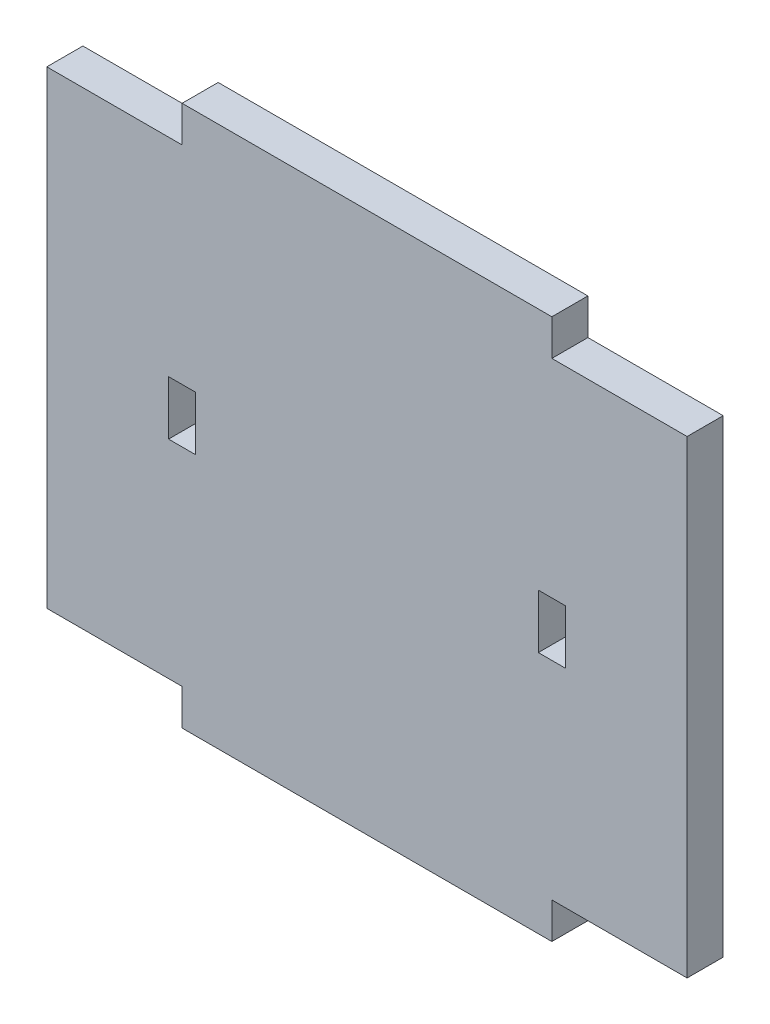
ISO-10303-21;
HEADER;
FILE_DESCRIPTION(('STEP AP214'),'2;1');
FILE_NAME('part.step','',(''),(''),'','','');
FILE_SCHEMA(('AUTOMOTIVE_DESIGN { 1 0 10303 214 1 1 1 1 }'));
ENDSEC;
DATA;
#1=APPLICATION_CONTEXT('core data for automotive mechanical design processes');
#2=APPLICATION_PROTOCOL_DEFINITION('international standard','automotive_design',2000,#1);
#3=PRODUCT_CONTEXT('',#1,'mechanical');
#4=PRODUCT('Part','Part','',(#3));
#5=PRODUCT_RELATED_PRODUCT_CATEGORY('part','',(#4));
#6=PRODUCT_DEFINITION_FORMATION('','',#4);
#7=PRODUCT_DEFINITION_CONTEXT('part definition',#1,'design');
#8=PRODUCT_DEFINITION('design','',#6,#7);
#9=PRODUCT_DEFINITION_SHAPE('','',#8);
#10=(LENGTH_UNIT() NAMED_UNIT(*) SI_UNIT(.MILLI.,.METRE.));
#11=(NAMED_UNIT(*) PLANE_ANGLE_UNIT() SI_UNIT($,.RADIAN.));
#12=(NAMED_UNIT(*) SI_UNIT($,.STERADIAN.) SOLID_ANGLE_UNIT());
#13=UNCERTAINTY_MEASURE_WITH_UNIT(LENGTH_MEASURE(1.E-05),#10,'distance_accuracy_value','');
#14=(GEOMETRIC_REPRESENTATION_CONTEXT(3) GLOBAL_UNCERTAINTY_ASSIGNED_CONTEXT((#13)) GLOBAL_UNIT_ASSIGNED_CONTEXT((#10,
#11,#12)) REPRESENTATION_CONTEXT('',''));
#15=CARTESIAN_POINT('',(0.,0.,0.));
#16=DIRECTION('',(0.,0.,1.));
#17=DIRECTION('',(1.,0.,0.));
#18=AXIS2_PLACEMENT_3D('',#15,#16,#17);
#19=CARTESIAN_POINT('',(-13.2631578947369,4.,4.));
#20=DIRECTION('',(1.,0.,0.));
#21=DIRECTION('',(0.,0.,-1.));
#22=AXIS2_PLACEMENT_3D('',#19,#20,#21);
#23=PLANE('',#22);
#24=DIRECTION('',(0.,-1.,0.));
#25=VECTOR('',#24,1.);
#26=CARTESIAN_POINT('',(-13.2631578947369,4.,0.));
#27=LINE('',#26,#25);
#28=CARTESIAN_POINT('',(-13.2631578947369,4.,0.));
#29=VERTEX_POINT('',#28);
#30=CARTESIAN_POINT('',(-13.2631578947369,0.,0.));
#31=VERTEX_POINT('',#30);
#32=EDGE_CURVE('E211',#29,#31,#27,.T.);
#33=ORIENTED_EDGE('',*,*,#32,.T.);
#34=DIRECTION('',(0.,0.,-1.));
#35=VECTOR('',#34,1.);
#36=CARTESIAN_POINT('',(-13.2631578947369,0.,4.));
#37=LINE('',#36,#35);
#38=CARTESIAN_POINT('',(-13.2631578947369,0.,4.));
#39=VERTEX_POINT('',#38);
#40=EDGE_CURVE('E300',#39,#31,#37,.T.);
#41=ORIENTED_EDGE('',*,*,#40,.F.);
#42=DIRECTION('',(0.,-1.,0.));
#43=VECTOR('',#42,1.);
#44=CARTESIAN_POINT('',(-13.2631578947369,4.,4.));
#45=LINE('',#44,#43);
#46=CARTESIAN_POINT('',(-13.2631578947369,4.,4.));
#47=VERTEX_POINT('',#46);
#48=EDGE_CURVE('E218',#47,#39,#45,.T.);
#49=ORIENTED_EDGE('',*,*,#48,.F.);
#50=DIRECTION('',(0.,0.,-1.));
#51=VECTOR('',#50,1.);
#52=CARTESIAN_POINT('',(-13.2631578947369,4.,4.));
#53=LINE('',#52,#51);
#54=EDGE_CURVE('E244',#47,#29,#53,.T.);
#55=ORIENTED_EDGE('',*,*,#54,.T.);
#56=EDGE_LOOP('',(#33,#41,#49,#55));
#57=FACE_BOUND('',#56,.T.);
#58=ADVANCED_FACE('F33',(#57),#23,.F.);
#59=CARTESIAN_POINT('',(-13.2631578947369,0.,4.));
#60=DIRECTION('',(0.,1.,0.));
#61=DIRECTION('',(0.,0.,1.));
#62=AXIS2_PLACEMENT_3D('',#59,#60,#61);
#63=PLANE('',#62);
#64=DIRECTION('',(1.,0.,0.));
#65=VECTOR('',#64,1.);
#66=CARTESIAN_POINT('',(-13.2631578947369,0.,0.));
#67=LINE('',#66,#65);
#68=CARTESIAN_POINT('',(27.7368421052632,0.,0.));
#69=VERTEX_POINT('',#68);
#70=EDGE_CURVE('E247',#31,#69,#67,.T.);
#71=ORIENTED_EDGE('',*,*,#70,.T.);
#72=DIRECTION('',(0.,0.,-1.));
#73=VECTOR('',#72,1.);
#74=CARTESIAN_POINT('',(27.7368421052632,0.,4.));
#75=LINE('',#74,#73);
#76=CARTESIAN_POINT('',(27.7368421052632,0.,4.));
#77=VERTEX_POINT('',#76);
#78=EDGE_CURVE('E297',#77,#69,#75,.T.);
#79=ORIENTED_EDGE('',*,*,#78,.F.);
#80=DIRECTION('',(1.,0.,0.));
#81=VECTOR('',#80,1.);
#82=CARTESIAN_POINT('',(-13.2631578947369,0.,4.));
#83=LINE('',#82,#81);
#84=EDGE_CURVE('E221',#39,#77,#83,.T.);
#85=ORIENTED_EDGE('',*,*,#84,.F.);
#86=ORIENTED_EDGE('',*,*,#40,.T.);
#87=EDGE_LOOP('',(#71,#79,#85,#86));
#88=FACE_BOUND('',#87,.T.);
#89=ADVANCED_FACE('F339',(#88),#63,.F.);
#90=CARTESIAN_POINT('',(27.7368421052632,0.,4.));
#91=DIRECTION('',(-1.,0.,0.));
#92=DIRECTION('',(0.,0.,1.));
#93=AXIS2_PLACEMENT_3D('',#90,#91,#92);
#94=PLANE('',#93);
#95=DIRECTION('',(0.,1.,0.));
#96=VECTOR('',#95,1.);
#97=CARTESIAN_POINT('',(27.7368421052632,0.,0.));
#98=LINE('',#97,#96);
#99=CARTESIAN_POINT('',(27.7368421052632,4.00000000000001,0.));
#100=VERTEX_POINT('',#99);
#101=EDGE_CURVE('E249',#69,#100,#98,.T.);
#102=ORIENTED_EDGE('',*,*,#101,.T.);
#103=DIRECTION('',(0.,0.,-1.));
#104=VECTOR('',#103,1.);
#105=CARTESIAN_POINT('',(27.7368421052632,4.00000000000001,4.));
#106=LINE('',#105,#104);
#107=CARTESIAN_POINT('',(27.7368421052632,4.00000000000001,4.));
#108=VERTEX_POINT('',#107);
#109=EDGE_CURVE('E294',#108,#100,#106,.T.);
#110=ORIENTED_EDGE('',*,*,#109,.F.);
#111=DIRECTION('',(0.,1.,0.));
#112=VECTOR('',#111,1.);
#113=CARTESIAN_POINT('',(27.7368421052632,0.,4.));
#114=LINE('',#113,#112);
#115=EDGE_CURVE('E224',#77,#108,#114,.T.);
#116=ORIENTED_EDGE('',*,*,#115,.F.);
#117=ORIENTED_EDGE('',*,*,#78,.T.);
#118=EDGE_LOOP('',(#102,#110,#116,#117));
#119=FACE_BOUND('',#118,.T.);
#120=ADVANCED_FACE('F344',(#119),#94,.F.);
#121=CARTESIAN_POINT('',(27.7368421052632,4.00000000000001,4.));
#122=DIRECTION('',(0.,1.,0.));
#123=DIRECTION('',(-1.,0.,0.));
#124=AXIS2_PLACEMENT_3D('',#121,#122,#123);
#125=PLANE('',#124);
#126=DIRECTION('',(1.,0.,0.));
#127=VECTOR('',#126,1.);
#128=CARTESIAN_POINT('',(27.7368421052632,4.00000000000001,0.));
#129=LINE('',#128,#127);
#130=CARTESIAN_POINT('',(42.7368421052632,4.00000000000001,0.));
#131=VERTEX_POINT('',#130);
#132=EDGE_CURVE('E251',#100,#131,#129,.T.);
#133=ORIENTED_EDGE('',*,*,#132,.T.);
#134=DIRECTION('',(0.,0.,-1.));
#135=VECTOR('',#134,1.);
#136=CARTESIAN_POINT('',(42.7368421052632,4.00000000000001,4.));
#137=LINE('',#136,#135);
#138=CARTESIAN_POINT('',(42.7368421052632,4.00000000000001,4.));
#139=VERTEX_POINT('',#138);
#140=EDGE_CURVE('E291',#139,#131,#137,.T.);
#141=ORIENTED_EDGE('',*,*,#140,.F.);
#142=DIRECTION('',(1.,0.,0.));
#143=VECTOR('',#142,1.);
#144=CARTESIAN_POINT('',(27.7368421052632,4.00000000000001,4.));
#145=LINE('',#144,#143);
#146=EDGE_CURVE('E226',#108,#139,#145,.T.);
#147=ORIENTED_EDGE('',*,*,#146,.F.);
#148=ORIENTED_EDGE('',*,*,#109,.T.);
#149=EDGE_LOOP('',(#133,#141,#147,#148));
#150=FACE_BOUND('',#149,.T.);
#151=ADVANCED_FACE('F397',(#150),#125,.F.);
#152=CARTESIAN_POINT('',(42.7368421052632,4.00000000000001,4.));
#153=DIRECTION('',(-1.,0.,0.));
#154=DIRECTION('',(0.,-1.,0.));
#155=AXIS2_PLACEMENT_3D('',#152,#153,#154);
#156=PLANE('',#155);
#157=DIRECTION('',(0.,1.,0.));
#158=VECTOR('',#157,1.);
#159=CARTESIAN_POINT('',(42.7368421052632,4.00000000000001,0.));
#160=LINE('',#159,#158);
#161=CARTESIAN_POINT('',(42.7368421052631,56.,0.));
#162=VERTEX_POINT('',#161);
#163=EDGE_CURVE('E253',#131,#162,#160,.T.);
#164=ORIENTED_EDGE('',*,*,#163,.T.);
#165=DIRECTION('',(0.,0.,-1.));
#166=VECTOR('',#165,1.);
#167=CARTESIAN_POINT('',(42.7368421052631,56.,4.));
#168=LINE('',#167,#166);
#169=CARTESIAN_POINT('',(42.7368421052631,56.,4.));
#170=VERTEX_POINT('',#169);
#171=EDGE_CURVE('E288',#170,#162,#168,.T.);
#172=ORIENTED_EDGE('',*,*,#171,.F.);
#173=DIRECTION('',(0.,1.,0.));
#174=VECTOR('',#173,1.);
#175=CARTESIAN_POINT('',(42.7368421052632,4.00000000000001,4.));
#176=LINE('',#175,#174);
#177=EDGE_CURVE('E228',#139,#170,#176,.T.);
#178=ORIENTED_EDGE('',*,*,#177,.F.);
#179=ORIENTED_EDGE('',*,*,#140,.T.);
#180=EDGE_LOOP('',(#164,#172,#178,#179));
#181=FACE_BOUND('',#180,.T.);
#182=ADVANCED_FACE('F394',(#181),#156,.F.);
#183=CARTESIAN_POINT('',(42.7368421052631,56.,4.));
#184=DIRECTION('',(0.,-1.,0.));
#185=DIRECTION('',(0.,0.,-1.));
#186=AXIS2_PLACEMENT_3D('',#183,#184,#185);
#187=PLANE('',#186);
#188=DIRECTION('',(-1.,0.,0.));
#189=VECTOR('',#188,1.);
#190=CARTESIAN_POINT('',(42.7368421052631,56.,0.));
#191=LINE('',#190,#189);
#192=CARTESIAN_POINT('',(27.7368421052631,56.,0.));
#193=VERTEX_POINT('',#192);
#194=EDGE_CURVE('E255',#162,#193,#191,.T.);
#195=ORIENTED_EDGE('',*,*,#194,.T.);
#196=DIRECTION('',(0.,0.,-1.));
#197=VECTOR('',#196,1.);
#198=CARTESIAN_POINT('',(27.7368421052631,56.,4.));
#199=LINE('',#198,#197);
#200=CARTESIAN_POINT('',(27.7368421052631,56.,4.));
#201=VERTEX_POINT('',#200);
#202=EDGE_CURVE('E285',#201,#193,#199,.T.);
#203=ORIENTED_EDGE('',*,*,#202,.F.);
#204=DIRECTION('',(-1.,0.,0.));
#205=VECTOR('',#204,1.);
#206=CARTESIAN_POINT('',(42.7368421052631,56.,4.));
#207=LINE('',#206,#205);
#208=EDGE_CURVE('E230',#170,#201,#207,.T.);
#209=ORIENTED_EDGE('',*,*,#208,.F.);
#210=ORIENTED_EDGE('',*,*,#171,.T.);
#211=EDGE_LOOP('',(#195,#203,#209,#210));
#212=FACE_BOUND('',#211,.T.);
#213=ADVANCED_FACE('F390',(#212),#187,.F.);
#214=CARTESIAN_POINT('',(27.7368421052631,56.,4.));
#215=DIRECTION('',(-1.,0.,0.));
#216=DIRECTION('',(0.,0.,1.));
#217=AXIS2_PLACEMENT_3D('',#214,#215,#216);
#218=PLANE('',#217);
#219=DIRECTION('',(0.,1.,0.));
#220=VECTOR('',#219,1.);
#221=CARTESIAN_POINT('',(27.7368421052631,56.,0.));
#222=LINE('',#221,#220);
#223=CARTESIAN_POINT('',(27.7368421052631,60.,0.));
#224=VERTEX_POINT('',#223);
#225=EDGE_CURVE('E257',#193,#224,#222,.T.);
#226=ORIENTED_EDGE('',*,*,#225,.T.);
#227=DIRECTION('',(0.,0.,-1.));
#228=VECTOR('',#227,1.);
#229=CARTESIAN_POINT('',(27.7368421052631,60.,4.));
#230=LINE('',#229,#228);
#231=CARTESIAN_POINT('',(27.7368421052631,60.,4.));
#232=VERTEX_POINT('',#231);
#233=EDGE_CURVE('E282',#232,#224,#230,.T.);
#234=ORIENTED_EDGE('',*,*,#233,.F.);
#235=DIRECTION('',(0.,1.,0.));
#236=VECTOR('',#235,1.);
#237=CARTESIAN_POINT('',(27.7368421052631,56.,4.));
#238=LINE('',#237,#236);
#239=EDGE_CURVE('E232',#201,#232,#238,.T.);
#240=ORIENTED_EDGE('',*,*,#239,.F.);
#241=ORIENTED_EDGE('',*,*,#202,.T.);
#242=EDGE_LOOP('',(#226,#234,#240,#241));
#243=FACE_BOUND('',#242,.T.);
#244=ADVANCED_FACE('F385',(#243),#218,.F.);
#245=CARTESIAN_POINT('',(27.7368421052631,60.,4.));
#246=DIRECTION('',(0.,-1.,0.));
#247=DIRECTION('',(0.,0.,-1.));
#248=AXIS2_PLACEMENT_3D('',#245,#246,#247);
#249=PLANE('',#248);
#250=DIRECTION('',(-1.,0.,0.));
#251=VECTOR('',#250,1.);
#252=CARTESIAN_POINT('',(27.7368421052631,60.,0.));
#253=LINE('',#252,#251);
#254=CARTESIAN_POINT('',(-13.2631578947369,60.,0.));
#255=VERTEX_POINT('',#254);
#256=EDGE_CURVE('E259',#224,#255,#253,.T.);
#257=ORIENTED_EDGE('',*,*,#256,.T.);
#258=DIRECTION('',(0.,0.,-1.));
#259=VECTOR('',#258,1.);
#260=CARTESIAN_POINT('',(-13.2631578947369,60.,4.));
#261=LINE('',#260,#259);
#262=CARTESIAN_POINT('',(-13.2631578947369,60.,4.));
#263=VERTEX_POINT('',#262);
#264=EDGE_CURVE('E279',#263,#255,#261,.T.);
#265=ORIENTED_EDGE('',*,*,#264,.F.);
#266=DIRECTION('',(-1.,0.,0.));
#267=VECTOR('',#266,1.);
#268=CARTESIAN_POINT('',(27.7368421052631,60.,4.));
#269=LINE('',#268,#267);
#270=EDGE_CURVE('E234',#232,#263,#269,.T.);
#271=ORIENTED_EDGE('',*,*,#270,.F.);
#272=ORIENTED_EDGE('',*,*,#233,.T.);
#273=EDGE_LOOP('',(#257,#265,#271,#272));
#274=FACE_BOUND('',#273,.T.);
#275=ADVANCED_FACE('F379',(#274),#249,.F.);
#276=CARTESIAN_POINT('',(-13.2631578947369,60.,4.));
#277=DIRECTION('',(1.,0.,0.));
#278=DIRECTION('',(0.,1.,0.));
#279=AXIS2_PLACEMENT_3D('',#276,#277,#278);
#280=PLANE('',#279);
#281=DIRECTION('',(0.,-1.,0.));
#282=VECTOR('',#281,1.);
#283=CARTESIAN_POINT('',(-13.2631578947369,60.,0.));
#284=LINE('',#283,#282);
#285=CARTESIAN_POINT('',(-13.2631578947369,56.,0.));
#286=VERTEX_POINT('',#285);
#287=EDGE_CURVE('E261',#255,#286,#284,.T.);
#288=ORIENTED_EDGE('',*,*,#287,.T.);
#289=DIRECTION('',(0.,0.,-1.));
#290=VECTOR('',#289,1.);
#291=CARTESIAN_POINT('',(-13.2631578947369,56.,4.));
#292=LINE('',#291,#290);
#293=CARTESIAN_POINT('',(-13.2631578947369,56.,4.));
#294=VERTEX_POINT('',#293);
#295=EDGE_CURVE('E276',#294,#286,#292,.T.);
#296=ORIENTED_EDGE('',*,*,#295,.F.);
#297=DIRECTION('',(0.,-1.,0.));
#298=VECTOR('',#297,1.);
#299=CARTESIAN_POINT('',(-13.2631578947369,60.,4.));
#300=LINE('',#299,#298);
#301=EDGE_CURVE('E236',#263,#294,#300,.T.);
#302=ORIENTED_EDGE('',*,*,#301,.F.);
#303=ORIENTED_EDGE('',*,*,#264,.T.);
#304=EDGE_LOOP('',(#288,#296,#302,#303));
#305=FACE_BOUND('',#304,.T.);
#306=ADVANCED_FACE('F375',(#305),#280,.F.);
#307=CARTESIAN_POINT('',(-13.2631578947369,56.,4.));
#308=DIRECTION('',(0.,-1.,0.));
#309=DIRECTION('',(0.,0.,-1.));
#310=AXIS2_PLACEMENT_3D('',#307,#308,#309);
#311=PLANE('',#310);
#312=DIRECTION('',(-1.,0.,0.));
#313=VECTOR('',#312,1.);
#314=CARTESIAN_POINT('',(-13.2631578947369,56.,0.));
#315=LINE('',#314,#313);
#316=CARTESIAN_POINT('',(-28.2631578947369,56.,0.));
#317=VERTEX_POINT('',#316);
#318=EDGE_CURVE('E263',#286,#317,#315,.T.);
#319=ORIENTED_EDGE('',*,*,#318,.T.);
#320=DIRECTION('',(0.,0.,-1.));
#321=VECTOR('',#320,1.);
#322=CARTESIAN_POINT('',(-28.2631578947369,56.,4.));
#323=LINE('',#322,#321);
#324=CARTESIAN_POINT('',(-28.2631578947369,56.,4.));
#325=VERTEX_POINT('',#324);
#326=EDGE_CURVE('E273',#325,#317,#323,.T.);
#327=ORIENTED_EDGE('',*,*,#326,.F.);
#328=DIRECTION('',(-1.,0.,0.));
#329=VECTOR('',#328,1.);
#330=CARTESIAN_POINT('',(-13.2631578947369,56.,4.));
#331=LINE('',#330,#329);
#332=EDGE_CURVE('E238',#294,#325,#331,.T.);
#333=ORIENTED_EDGE('',*,*,#332,.F.);
#334=ORIENTED_EDGE('',*,*,#295,.T.);
#335=EDGE_LOOP('',(#319,#327,#333,#334));
#336=FACE_BOUND('',#335,.T.);
#337=ADVANCED_FACE('F370',(#336),#311,.F.);
#338=CARTESIAN_POINT('',(-28.2631578947369,56.,4.));
#339=DIRECTION('',(1.,0.,0.));
#340=DIRECTION('',(0.,1.,0.));
#341=AXIS2_PLACEMENT_3D('',#338,#339,#340);
#342=PLANE('',#341);
#343=DIRECTION('',(0.,-1.,0.));
#344=VECTOR('',#343,1.);
#345=CARTESIAN_POINT('',(-28.2631578947369,56.,0.));
#346=LINE('',#345,#344);
#347=CARTESIAN_POINT('',(-28.2631578947368,4.,0.));
#348=VERTEX_POINT('',#347);
#349=EDGE_CURVE('E265',#317,#348,#346,.T.);
#350=ORIENTED_EDGE('',*,*,#349,.T.);
#351=DIRECTION('',(0.,0.,-1.));
#352=VECTOR('',#351,1.);
#353=CARTESIAN_POINT('',(-28.2631578947368,4.,4.));
#354=LINE('',#353,#352);
#355=CARTESIAN_POINT('',(-28.2631578947368,4.,4.));
#356=VERTEX_POINT('',#355);
#357=EDGE_CURVE('E270',#356,#348,#354,.T.);
#358=ORIENTED_EDGE('',*,*,#357,.F.);
#359=DIRECTION('',(0.,-1.,0.));
#360=VECTOR('',#359,1.);
#361=CARTESIAN_POINT('',(-28.2631578947369,56.,4.));
#362=LINE('',#361,#360);
#363=EDGE_CURVE('E240',#325,#356,#362,.T.);
#364=ORIENTED_EDGE('',*,*,#363,.F.);
#365=ORIENTED_EDGE('',*,*,#326,.T.);
#366=EDGE_LOOP('',(#350,#358,#364,#365));
#367=FACE_BOUND('',#366,.T.);
#368=ADVANCED_FACE('F364',(#367),#342,.F.);
#369=CARTESIAN_POINT('',(-28.2631578947368,4.,4.));
#370=DIRECTION('',(0.,1.,0.));
#371=DIRECTION('',(-1.,0.,0.));
#372=AXIS2_PLACEMENT_3D('',#369,#370,#371);
#373=PLANE('',#372);
#374=DIRECTION('',(1.,0.,0.));
#375=VECTOR('',#374,1.);
#376=CARTESIAN_POINT('',(-28.2631578947368,4.,0.));
#377=LINE('',#376,#375);
#378=EDGE_CURVE('E222',#348,#29,#377,.T.);
#379=ORIENTED_EDGE('',*,*,#378,.T.);
#380=ORIENTED_EDGE('',*,*,#54,.F.);
#381=DIRECTION('',(1.,0.,0.));
#382=VECTOR('',#381,1.);
#383=CARTESIAN_POINT('',(-28.2631578947368,4.,4.));
#384=LINE('',#383,#382);
#385=EDGE_CURVE('E242',#356,#47,#384,.T.);
#386=ORIENTED_EDGE('',*,*,#385,.F.);
#387=ORIENTED_EDGE('',*,*,#357,.T.);
#388=EDGE_LOOP('',(#379,#380,#386,#387));
#389=FACE_BOUND('',#388,.T.);
#390=ADVANCED_FACE('F362',(#389),#373,.F.);
#391=CARTESIAN_POINT('',(0.,0.,4.));
#392=DIRECTION('',(0.,0.,1.));
#393=DIRECTION('',(1.,0.,0.));
#394=AXIS2_PLACEMENT_3D('',#391,#392,#393);
#395=PLANE('',#394);
#396=DIRECTION('',(0.,1.,0.));
#397=VECTOR('',#396,1.);
#398=CARTESIAN_POINT('',(29.2368421052631,33.,4.));
#399=LINE('',#398,#397);
#400=CARTESIAN_POINT('',(29.2368421052631,27.,4.));
#401=VERTEX_POINT('',#400);
#402=CARTESIAN_POINT('',(29.2368421052631,33.,4.));
#403=VERTEX_POINT('',#402);
#404=EDGE_CURVE('E47',#401,#403,#399,.T.);
#405=ORIENTED_EDGE('',*,*,#404,.F.);
#406=DIRECTION('',(1.,0.,0.));
#407=VECTOR('',#406,1.);
#408=CARTESIAN_POINT('',(29.2368421052631,27.,4.));
#409=LINE('',#408,#407);
#410=CARTESIAN_POINT('',(26.2368421052631,27.,4.));
#411=VERTEX_POINT('',#410);
#412=EDGE_CURVE('E188',#411,#401,#409,.T.);
#413=ORIENTED_EDGE('',*,*,#412,.F.);
#414=DIRECTION('',(0.,-1.,0.));
#415=VECTOR('',#414,1.);
#416=CARTESIAN_POINT('',(26.2368421052631,33.,4.));
#417=LINE('',#416,#415);
#418=CARTESIAN_POINT('',(26.2368421052631,33.,4.));
#419=VERTEX_POINT('',#418);
#420=EDGE_CURVE('E172',#419,#411,#417,.T.);
#421=ORIENTED_EDGE('',*,*,#420,.F.);
#422=DIRECTION('',(-1.,0.,0.));
#423=VECTOR('',#422,1.);
#424=CARTESIAN_POINT('',(29.2368421052631,33.,4.));
#425=LINE('',#424,#423);
#426=EDGE_CURVE('E181',#403,#419,#425,.T.);
#427=ORIENTED_EDGE('',*,*,#426,.F.);
#428=EDGE_LOOP('',(#405,#413,#421,#427));
#429=FACE_BOUND('',#428,.T.);
#430=DIRECTION('',(0.,-1.,0.));
#431=VECTOR('',#430,1.);
#432=CARTESIAN_POINT('',(-14.7631578947369,33.,4.));
#433=LINE('',#432,#431);
#434=CARTESIAN_POINT('',(-14.7631578947369,33.,4.));
#435=VERTEX_POINT('',#434);
#436=CARTESIAN_POINT('',(-14.7631578947369,27.,4.));
#437=VERTEX_POINT('',#436);
#438=EDGE_CURVE('E195',#435,#437,#433,.T.);
#439=ORIENTED_EDGE('',*,*,#438,.F.);
#440=DIRECTION('',(-1.,0.,0.));
#441=VECTOR('',#440,1.);
#442=CARTESIAN_POINT('',(-14.7631578947369,33.,4.));
#443=LINE('',#442,#441);
#444=CARTESIAN_POINT('',(-11.7631578947369,33.,4.));
#445=VERTEX_POINT('',#444);
#446=EDGE_CURVE('E205',#445,#435,#443,.T.);
#447=ORIENTED_EDGE('',*,*,#446,.F.);
#448=DIRECTION('',(0.,1.,0.));
#449=VECTOR('',#448,1.);
#450=CARTESIAN_POINT('',(-11.7631578947369,33.,4.));
#451=LINE('',#450,#449);
#452=CARTESIAN_POINT('',(-11.7631578947369,27.,4.));
#453=VERTEX_POINT('',#452);
#454=EDGE_CURVE('E202',#453,#445,#451,.T.);
#455=ORIENTED_EDGE('',*,*,#454,.F.);
#456=DIRECTION('',(1.,0.,0.));
#457=VECTOR('',#456,1.);
#458=CARTESIAN_POINT('',(-14.7631578947369,27.,4.));
#459=LINE('',#458,#457);
#460=EDGE_CURVE('E199',#437,#453,#459,.T.);
#461=ORIENTED_EDGE('',*,*,#460,.F.);
#462=EDGE_LOOP('',(#439,#447,#455,#461));
#463=FACE_BOUND('',#462,.T.);
#464=ORIENTED_EDGE('',*,*,#48,.T.);
#465=ORIENTED_EDGE('',*,*,#84,.T.);
#466=ORIENTED_EDGE('',*,*,#115,.T.);
#467=ORIENTED_EDGE('',*,*,#146,.T.);
#468=ORIENTED_EDGE('',*,*,#177,.T.);
#469=ORIENTED_EDGE('',*,*,#208,.T.);
#470=ORIENTED_EDGE('',*,*,#239,.T.);
#471=ORIENTED_EDGE('',*,*,#270,.T.);
#472=ORIENTED_EDGE('',*,*,#301,.T.);
#473=ORIENTED_EDGE('',*,*,#332,.T.);
#474=ORIENTED_EDGE('',*,*,#363,.T.);
#475=ORIENTED_EDGE('',*,*,#385,.T.);
#476=EDGE_LOOP('',(#464,#465,#466,#467,#468,#469,#470,#471,#472,#473,#474,#475));
#477=FACE_BOUND('',#476,.T.);
#478=ADVANCED_FACE('F185',(#429,#463,#477),#395,.T.);
#479=CARTESIAN_POINT('',(0.,0.,0.));
#480=DIRECTION('',(0.,0.,1.));
#481=DIRECTION('',(1.,0.,0.));
#482=AXIS2_PLACEMENT_3D('',#479,#480,#481);
#483=PLANE('',#482);
#484=DIRECTION('',(1.,0.,0.));
#485=VECTOR('',#484,1.);
#486=CARTESIAN_POINT('',(0.,27.,0.));
#487=LINE('',#486,#485);
#488=CARTESIAN_POINT('',(26.2368421052631,27.,0.));
#489=VERTEX_POINT('',#488);
#490=CARTESIAN_POINT('',(29.2368421052631,27.,0.));
#491=VERTEX_POINT('',#490);
#492=EDGE_CURVE('E40',#489,#491,#487,.T.);
#493=ORIENTED_EDGE('',*,*,#492,.T.);
#494=DIRECTION('',(0.,1.,0.));
#495=VECTOR('',#494,1.);
#496=CARTESIAN_POINT('',(29.2368421052631,0.,0.));
#497=LINE('',#496,#495);
#498=CARTESIAN_POINT('',(29.2368421052631,33.,0.));
#499=VERTEX_POINT('',#498);
#500=EDGE_CURVE('E11',#491,#499,#497,.T.);
#501=ORIENTED_EDGE('',*,*,#500,.T.);
#502=DIRECTION('',(-1.,0.,0.));
#503=VECTOR('',#502,1.);
#504=CARTESIAN_POINT('',(0.,33.,0.));
#505=LINE('',#504,#503);
#506=CARTESIAN_POINT('',(26.2368421052631,33.,0.));
#507=VERTEX_POINT('',#506);
#508=EDGE_CURVE('E315',#499,#507,#505,.T.);
#509=ORIENTED_EDGE('',*,*,#508,.T.);
#510=DIRECTION('',(0.,-1.,0.));
#511=VECTOR('',#510,1.);
#512=CARTESIAN_POINT('',(26.2368421052631,0.,0.));
#513=LINE('',#512,#511);
#514=EDGE_CURVE('E175',#507,#489,#513,.T.);
#515=ORIENTED_EDGE('',*,*,#514,.T.);
#516=EDGE_LOOP('',(#493,#501,#509,#515));
#517=FACE_BOUND('',#516,.T.);
#518=DIRECTION('',(-1.,0.,0.));
#519=VECTOR('',#518,1.);
#520=CARTESIAN_POINT('',(0.,33.,0.));
#521=LINE('',#520,#519);
#522=CARTESIAN_POINT('',(-11.7631578947369,33.,0.));
#523=VERTEX_POINT('',#522);
#524=CARTESIAN_POINT('',(-14.7631578947369,33.,0.));
#525=VERTEX_POINT('',#524);
#526=EDGE_CURVE('E309',#523,#525,#521,.T.);
#527=ORIENTED_EDGE('',*,*,#526,.T.);
#528=DIRECTION('',(0.,-1.,0.));
#529=VECTOR('',#528,1.);
#530=CARTESIAN_POINT('',(-14.7631578947369,0.,0.));
#531=LINE('',#530,#529);
#532=CARTESIAN_POINT('',(-14.7631578947369,27.,0.));
#533=VERTEX_POINT('',#532);
#534=EDGE_CURVE('E312',#525,#533,#531,.T.);
#535=ORIENTED_EDGE('',*,*,#534,.T.);
#536=DIRECTION('',(1.,0.,0.));
#537=VECTOR('',#536,1.);
#538=CARTESIAN_POINT('',(0.,27.,0.));
#539=LINE('',#538,#537);
#540=CARTESIAN_POINT('',(-11.7631578947369,27.,0.));
#541=VERTEX_POINT('',#540);
#542=EDGE_CURVE('E303',#533,#541,#539,.T.);
#543=ORIENTED_EDGE('',*,*,#542,.T.);
#544=DIRECTION('',(0.,1.,0.));
#545=VECTOR('',#544,1.);
#546=CARTESIAN_POINT('',(-11.7631578947369,0.,0.));
#547=LINE('',#546,#545);
#548=EDGE_CURVE('E306',#541,#523,#547,.T.);
#549=ORIENTED_EDGE('',*,*,#548,.T.);
#550=EDGE_LOOP('',(#527,#535,#543,#549));
#551=FACE_BOUND('',#550,.T.);
#552=ORIENTED_EDGE('',*,*,#32,.F.);
#553=ORIENTED_EDGE('',*,*,#378,.F.);
#554=ORIENTED_EDGE('',*,*,#349,.F.);
#555=ORIENTED_EDGE('',*,*,#318,.F.);
#556=ORIENTED_EDGE('',*,*,#287,.F.);
#557=ORIENTED_EDGE('',*,*,#256,.F.);
#558=ORIENTED_EDGE('',*,*,#225,.F.);
#559=ORIENTED_EDGE('',*,*,#194,.F.);
#560=ORIENTED_EDGE('',*,*,#163,.F.);
#561=ORIENTED_EDGE('',*,*,#132,.F.);
#562=ORIENTED_EDGE('',*,*,#101,.F.);
#563=ORIENTED_EDGE('',*,*,#70,.F.);
#564=EDGE_LOOP('',(#552,#553,#554,#555,#556,#557,#558,#559,#560,#561,#562,#563));
#565=FACE_BOUND('',#564,.T.);
#566=ADVANCED_FACE('F319',(#517,#551,#565),#483,.F.);
#567=CARTESIAN_POINT('',(-14.7631578947369,33.,-6.));
#568=DIRECTION('',(-1.,0.,0.));
#569=DIRECTION('',(0.,0.,1.));
#570=AXIS2_PLACEMENT_3D('',#567,#568,#569);
#571=PLANE('',#570);
#572=DIRECTION('',(0.,0.,1.));
#573=VECTOR('',#572,1.);
#574=CARTESIAN_POINT('',(-14.7631578947369,33.,-6.));
#575=LINE('',#574,#573);
#576=EDGE_CURVE('E209',#525,#435,#575,.T.);
#577=ORIENTED_EDGE('',*,*,#576,.T.);
#578=ORIENTED_EDGE('',*,*,#438,.T.);
#579=DIRECTION('',(0.,0.,1.));
#580=VECTOR('',#579,1.);
#581=CARTESIAN_POINT('',(-14.7631578947369,27.,-6.));
#582=LINE('',#581,#580);
#583=EDGE_CURVE('E208',#533,#437,#582,.T.);
#584=ORIENTED_EDGE('',*,*,#583,.F.);
#585=ORIENTED_EDGE('',*,*,#534,.F.);
#586=EDGE_LOOP('',(#577,#578,#584,#585));
#587=FACE_BOUND('',#586,.T.);
#588=ADVANCED_FACE('F426',(#587),#571,.F.);
#589=CARTESIAN_POINT('',(-14.7631578947369,33.,-6.));
#590=DIRECTION('',(0.,1.,0.));
#591=DIRECTION('',(0.,0.,1.));
#592=AXIS2_PLACEMENT_3D('',#589,#590,#591);
#593=PLANE('',#592);
#594=DIRECTION('',(0.,0.,1.));
#595=VECTOR('',#594,1.);
#596=CARTESIAN_POINT('',(-11.7631578947369,33.,-6.));
#597=LINE('',#596,#595);
#598=EDGE_CURVE('E212',#523,#445,#597,.T.);
#599=ORIENTED_EDGE('',*,*,#598,.T.);
#600=ORIENTED_EDGE('',*,*,#446,.T.);
#601=ORIENTED_EDGE('',*,*,#576,.F.);
#602=ORIENTED_EDGE('',*,*,#526,.F.);
#603=EDGE_LOOP('',(#599,#600,#601,#602));
#604=FACE_BOUND('',#603,.T.);
#605=ADVANCED_FACE('F430',(#604),#593,.F.);
#606=CARTESIAN_POINT('',(-11.7631578947369,33.,-6.));
#607=DIRECTION('',(1.,0.,0.));
#608=DIRECTION('',(0.,0.,-1.));
#609=AXIS2_PLACEMENT_3D('',#606,#607,#608);
#610=PLANE('',#609);
#611=DIRECTION('',(0.,0.,1.));
#612=VECTOR('',#611,1.);
#613=CARTESIAN_POINT('',(-11.7631578947369,27.,-6.));
#614=LINE('',#613,#612);
#615=EDGE_CURVE('E214',#541,#453,#614,.T.);
#616=ORIENTED_EDGE('',*,*,#615,.T.);
#617=ORIENTED_EDGE('',*,*,#454,.T.);
#618=ORIENTED_EDGE('',*,*,#598,.F.);
#619=ORIENTED_EDGE('',*,*,#548,.F.);
#620=EDGE_LOOP('',(#616,#617,#618,#619));
#621=FACE_BOUND('',#620,.T.);
#622=ADVANCED_FACE('F333',(#621),#610,.F.);
#623=CARTESIAN_POINT('',(-14.7631578947369,27.,-6.));
#624=DIRECTION('',(0.,-1.,0.));
#625=DIRECTION('',(0.,0.,-1.));
#626=AXIS2_PLACEMENT_3D('',#623,#624,#625);
#627=PLANE('',#626);
#628=ORIENTED_EDGE('',*,*,#583,.T.);
#629=ORIENTED_EDGE('',*,*,#460,.T.);
#630=ORIENTED_EDGE('',*,*,#615,.F.);
#631=ORIENTED_EDGE('',*,*,#542,.F.);
#632=EDGE_LOOP('',(#628,#629,#630,#631));
#633=FACE_BOUND('',#632,.T.);
#634=ADVANCED_FACE('F326',(#633),#627,.F.);
#635=CARTESIAN_POINT('',(29.2368421052631,33.,-6.));
#636=DIRECTION('',(1.,0.,0.));
#637=DIRECTION('',(0.,0.,-1.));
#638=AXIS2_PLACEMENT_3D('',#635,#636,#637);
#639=PLANE('',#638);
#640=DIRECTION('',(0.,0.,1.));
#641=VECTOR('',#640,1.);
#642=CARTESIAN_POINT('',(29.2368421052631,27.,-6.));
#643=LINE('',#642,#641);
#644=EDGE_CURVE('E193',#491,#401,#643,.T.);
#645=ORIENTED_EDGE('',*,*,#644,.T.);
#646=ORIENTED_EDGE('',*,*,#404,.T.);
#647=DIRECTION('',(0.,0.,1.));
#648=VECTOR('',#647,1.);
#649=CARTESIAN_POINT('',(29.2368421052631,33.,-6.));
#650=LINE('',#649,#648);
#651=EDGE_CURVE('E178',#499,#403,#650,.T.);
#652=ORIENTED_EDGE('',*,*,#651,.F.);
#653=ORIENTED_EDGE('',*,*,#500,.F.);
#654=EDGE_LOOP('',(#645,#646,#652,#653));
#655=FACE_BOUND('',#654,.T.);
#656=ADVANCED_FACE('F324',(#655),#639,.F.);
#657=CARTESIAN_POINT('',(29.2368421052631,27.,-6.));
#658=DIRECTION('',(0.,-1.,0.));
#659=DIRECTION('',(1.,0.,0.));
#660=AXIS2_PLACEMENT_3D('',#657,#658,#659);
#661=PLANE('',#660);
#662=DIRECTION('',(0.,0.,1.));
#663=VECTOR('',#662,1.);
#664=CARTESIAN_POINT('',(26.2368421052631,27.,-6.));
#665=LINE('',#664,#663);
#666=EDGE_CURVE('E177',#489,#411,#665,.T.);
#667=ORIENTED_EDGE('',*,*,#666,.T.);
#668=ORIENTED_EDGE('',*,*,#412,.T.);
#669=ORIENTED_EDGE('',*,*,#644,.F.);
#670=ORIENTED_EDGE('',*,*,#492,.F.);
#671=EDGE_LOOP('',(#667,#668,#669,#670));
#672=FACE_BOUND('',#671,.T.);
#673=ADVANCED_FACE('F323',(#672),#661,.F.);
#674=CARTESIAN_POINT('',(26.2368421052631,33.,-6.));
#675=DIRECTION('',(-1.,0.,0.));
#676=DIRECTION('',(0.,0.,1.));
#677=AXIS2_PLACEMENT_3D('',#674,#675,#676);
#678=PLANE('',#677);
#679=DIRECTION('',(0.,0.,1.));
#680=VECTOR('',#679,1.);
#681=CARTESIAN_POINT('',(26.2368421052631,33.,-6.));
#682=LINE('',#681,#680);
#683=EDGE_CURVE('E55',#507,#419,#682,.T.);
#684=ORIENTED_EDGE('',*,*,#683,.T.);
#685=ORIENTED_EDGE('',*,*,#420,.T.);
#686=ORIENTED_EDGE('',*,*,#666,.F.);
#687=ORIENTED_EDGE('',*,*,#514,.F.);
#688=EDGE_LOOP('',(#684,#685,#686,#687));
#689=FACE_BOUND('',#688,.T.);
#690=ADVANCED_FACE('F169',(#689),#678,.F.);
#691=CARTESIAN_POINT('',(29.2368421052631,33.,-6.));
#692=DIRECTION('',(0.,1.,0.));
#693=DIRECTION('',(0.,0.,1.));
#694=AXIS2_PLACEMENT_3D('',#691,#692,#693);
#695=PLANE('',#694);
#696=ORIENTED_EDGE('',*,*,#651,.T.);
#697=ORIENTED_EDGE('',*,*,#426,.T.);
#698=ORIENTED_EDGE('',*,*,#683,.F.);
#699=ORIENTED_EDGE('',*,*,#508,.F.);
#700=EDGE_LOOP('',(#696,#697,#698,#699));
#701=FACE_BOUND('',#700,.T.);
#702=ADVANCED_FACE('F182',(#701),#695,.F.);
#703=CLOSED_SHELL('',(#58,#89,#120,#151,#182,#213,#244,#275,#306,#337,#368,#390,#478,#566,#588,
#605,#622,#634,#656,#673,#690,#702));
#704=MANIFOLD_SOLID_BREP('B2',#703);
#705=ADVANCED_BREP_SHAPE_REPRESENTATION('',(#18,#704),#14);
#706=SHAPE_DEFINITION_REPRESENTATION(#9,#705);
ENDSEC;
END-ISO-10303-21;
